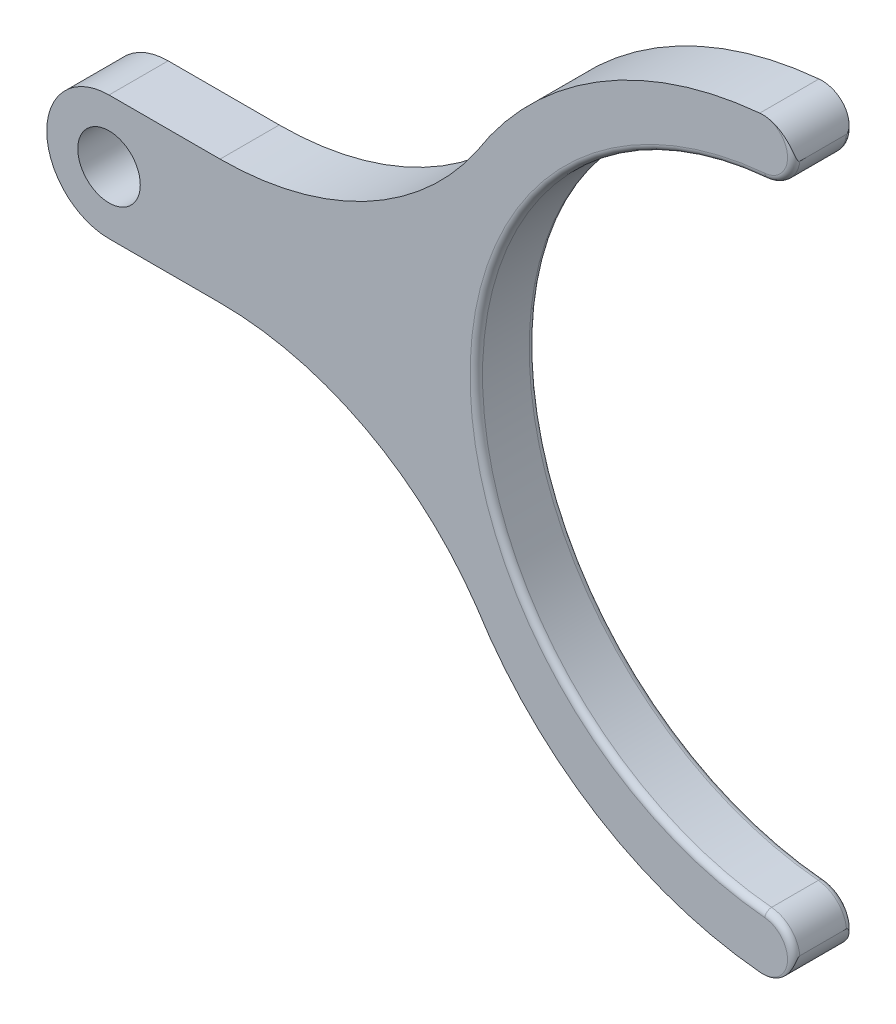
ISO-10303-21;
HEADER;
FILE_DESCRIPTION(('STEP AP214'),'2;1');
FILE_NAME('part.step','',(''),(''),'','','');
FILE_SCHEMA(('AUTOMOTIVE_DESIGN { 1 0 10303 214 1 1 1 1 }'));
ENDSEC;
DATA;
#1=APPLICATION_CONTEXT('core data for automotive mechanical design processes');
#2=APPLICATION_PROTOCOL_DEFINITION('international standard','automotive_design',2000,#1);
#3=PRODUCT_CONTEXT('',#1,'mechanical');
#4=PRODUCT('Part','Part','',(#3));
#5=PRODUCT_RELATED_PRODUCT_CATEGORY('part','',(#4));
#6=PRODUCT_DEFINITION_FORMATION('','',#4);
#7=PRODUCT_DEFINITION_CONTEXT('part definition',#1,'design');
#8=PRODUCT_DEFINITION('design','',#6,#7);
#9=PRODUCT_DEFINITION_SHAPE('','',#8);
#10=(LENGTH_UNIT() NAMED_UNIT(*) SI_UNIT(.MILLI.,.METRE.));
#11=(NAMED_UNIT(*) PLANE_ANGLE_UNIT() SI_UNIT($,.RADIAN.));
#12=(NAMED_UNIT(*) SI_UNIT($,.STERADIAN.) SOLID_ANGLE_UNIT());
#13=UNCERTAINTY_MEASURE_WITH_UNIT(LENGTH_MEASURE(1.E-05),#10,'distance_accuracy_value','');
#14=(GEOMETRIC_REPRESENTATION_CONTEXT(3) GLOBAL_UNCERTAINTY_ASSIGNED_CONTEXT((#13)) GLOBAL_UNIT_ASSIGNED_CONTEXT((#10,
#11,#12)) REPRESENTATION_CONTEXT('',''));
#15=CARTESIAN_POINT('',(0.,0.,0.));
#16=DIRECTION('',(0.,0.,1.));
#17=DIRECTION('',(1.,0.,0.));
#18=AXIS2_PLACEMENT_3D('',#15,#16,#17);
#19=CARTESIAN_POINT('',(-41.1562310109537,60.,4.75));
#20=DIRECTION('',(0.,0.,1.));
#21=DIRECTION('',(1.,0.,0.));
#22=AXIS2_PLACEMENT_3D('',#19,#20,#21);
#23=PLANE('',#22);
#24=CARTESIAN_POINT('',(46.,-54.7722557505166,4.75));
#25=DIRECTION('',(0.,0.,1.));
#26=DIRECTION('',(1.,0.,0.));
#27=AXIS2_PLACEMENT_3D('',#24,#25,#26);
#28=CIRCLE('',#27,5.);
#29=CARTESIAN_POINT('',(45.5454545454545,-59.7515517278363,4.75));
#30=VERTEX_POINT('',#29);
#31=CARTESIAN_POINT('',(46.4028910081031,-59.7559972000292,4.75));
#32=VERTEX_POINT('',#31);
#33=EDGE_CURVE('E196',#30,#32,#28,.T.);
#34=ORIENTED_EDGE('',*,*,#33,.T.);
#35=CARTESIAN_POINT('',(46.,-55.7763390695374,4.75));
#36=DIRECTION('',(0.,0.,1.));
#37=DIRECTION('',(1.,0.,0.));
#38=AXIS2_PLACEMENT_3D('',#35,#36,#37);
#39=CIRCLE('',#38,4.);
#40=CARTESIAN_POINT('',(46.3571428571428,-51.7923148502847,4.75));
#41=VERTEX_POINT('',#40);
#42=EDGE_CURVE('E453',#32,#41,#39,.T.);
#43=ORIENTED_EDGE('',*,*,#42,.T.);
#44=CARTESIAN_POINT('',(51.,0.,4.75));
#45=DIRECTION('',(0.,0.,1.));
#46=DIRECTION('',(1.,0.,0.));
#47=AXIS2_PLACEMENT_3D('',#44,#45,#46);
#48=CIRCLE('',#47,52.);
#49=CARTESIAN_POINT('',(46.3571428571428,51.7923148502847,4.75));
#50=VERTEX_POINT('',#49);
#51=EDGE_CURVE('E56',#41,#50,#48,.F.);
#52=ORIENTED_EDGE('',*,*,#51,.T.);
#53=CARTESIAN_POINT('',(46.,55.7763390695374,4.75));
#54=DIRECTION('',(0.,0.,1.));
#55=DIRECTION('',(1.,0.,0.));
#56=AXIS2_PLACEMENT_3D('',#53,#54,#55);
#57=CIRCLE('',#56,4.);
#58=CARTESIAN_POINT('',(46.4028910081031,59.7559972000292,4.75));
#59=VERTEX_POINT('',#58);
#60=EDGE_CURVE('E454',#50,#59,#57,.T.);
#61=ORIENTED_EDGE('',*,*,#60,.T.);
#62=CARTESIAN_POINT('',(46.,54.7722557505166,4.75));
#63=DIRECTION('',(0.,0.,1.));
#64=DIRECTION('',(1.,0.,0.));
#65=AXIS2_PLACEMENT_3D('',#62,#63,#64);
#66=CIRCLE('',#65,5.);
#67=CARTESIAN_POINT('',(45.5454545454545,59.7515517278363,4.75));
#68=VERTEX_POINT('',#67);
#69=EDGE_CURVE('E198',#59,#68,#66,.T.);
#70=ORIENTED_EDGE('',*,*,#69,.T.);
#71=CARTESIAN_POINT('',(51.,0.,4.75));
#72=DIRECTION('',(0.,0.,1.));
#73=DIRECTION('',(1.,0.,0.));
#74=AXIS2_PLACEMENT_3D('',#71,#72,#73);
#75=CIRCLE('',#74,60.);
#76=CARTESIAN_POINT('',(0.,31.6069612585582,4.75));
#77=VERTEX_POINT('',#76);
#78=EDGE_CURVE('E172',#68,#77,#75,.T.);
#79=ORIENTED_EDGE('',*,*,#78,.T.);
#80=CARTESIAN_POINT('',(-41.1562310109537,60.,4.75));
#81=DIRECTION('',(0.,0.,-1.));
#82=DIRECTION('',(1.,0.,0.));
#83=AXIS2_PLACEMENT_3D('',#80,#81,#82);
#84=CIRCLE('',#83,50.);
#85=CARTESIAN_POINT('',(-41.1562310109537,9.99999999999999,4.75));
#86=VERTEX_POINT('',#85);
#87=EDGE_CURVE('E166',#77,#86,#84,.T.);
#88=ORIENTED_EDGE('',*,*,#87,.T.);
#89=DIRECTION('',(-1.,0.,0.));
#90=VECTOR('',#89,1.);
#91=CARTESIAN_POINT('',(-41.1562310109537,9.99999999999999,4.75));
#92=LINE('',#91,#90);
#93=CARTESIAN_POINT('',(-59.,10.,4.75));
#94=VERTEX_POINT('',#93);
#95=EDGE_CURVE('E159',#86,#94,#92,.T.);
#96=ORIENTED_EDGE('',*,*,#95,.T.);
#97=CARTESIAN_POINT('',(-59.,0.,4.75));
#98=DIRECTION('',(0.,0.,1.));
#99=DIRECTION('',(1.,0.,0.));
#100=AXIS2_PLACEMENT_3D('',#97,#98,#99);
#101=CIRCLE('',#100,10.);
#102=CARTESIAN_POINT('',(-59.,-10.,4.75));
#103=VERTEX_POINT('',#102);
#104=EDGE_CURVE('E170',#94,#103,#101,.T.);
#105=ORIENTED_EDGE('',*,*,#104,.T.);
#106=DIRECTION('',(1.,0.,0.));
#107=VECTOR('',#106,1.);
#108=CARTESIAN_POINT('',(-41.1562310109537,-9.99999999999999,4.75));
#109=LINE('',#108,#107);
#110=CARTESIAN_POINT('',(-41.1562310109537,-9.99999999999999,4.75));
#111=VERTEX_POINT('',#110);
#112=EDGE_CURVE('E495',#103,#111,#109,.T.);
#113=ORIENTED_EDGE('',*,*,#112,.T.);
#114=CARTESIAN_POINT('',(-41.1562310109537,-60.,4.75));
#115=DIRECTION('',(0.,0.,-1.));
#116=DIRECTION('',(-1.,0.,0.));
#117=AXIS2_PLACEMENT_3D('',#114,#115,#116);
#118=CIRCLE('',#117,50.);
#119=CARTESIAN_POINT('',(0.,-31.6069612585582,4.75));
#120=VERTEX_POINT('',#119);
#121=EDGE_CURVE('E507',#111,#120,#118,.T.);
#122=ORIENTED_EDGE('',*,*,#121,.T.);
#123=CARTESIAN_POINT('',(51.,0.,4.75));
#124=DIRECTION('',(0.,0.,1.));
#125=DIRECTION('',(1.,0.,0.));
#126=AXIS2_PLACEMENT_3D('',#123,#124,#125);
#127=CIRCLE('',#126,60.);
#128=EDGE_CURVE('E504',#120,#30,#127,.T.);
#129=ORIENTED_EDGE('',*,*,#128,.T.);
#130=EDGE_LOOP('',(#34,#43,#52,#61,#70,#79,#88,#96,#105,#113,#122,#129));
#131=FACE_BOUND('',#130,.T.);
#132=CARTESIAN_POINT('',(-59.,0.,4.75));
#133=DIRECTION('',(0.,0.,1.));
#134=DIRECTION('',(1.,0.,0.));
#135=AXIS2_PLACEMENT_3D('',#132,#133,#134);
#136=CIRCLE('',#135,5.02);
#137=CARTESIAN_POINT('',(-53.98,0.,4.75));
#138=VERTEX_POINT('',#137);
#139=EDGE_CURVE('E503',#138,#138,#136,.T.);
#140=ORIENTED_EDGE('',*,*,#139,.F.);
#141=EDGE_LOOP('',(#140));
#142=FACE_BOUND('',#141,.T.);
#143=ADVANCED_FACE('F41',(#131,#142),#23,.T.);
#144=CARTESIAN_POINT('',(-41.1562310109537,60.,-4.75));
#145=DIRECTION('',(0.,0.,1.));
#146=DIRECTION('',(1.,0.,0.));
#147=AXIS2_PLACEMENT_3D('',#144,#145,#146);
#148=PLANE('',#147);
#149=CARTESIAN_POINT('',(51.,0.,-4.75));
#150=DIRECTION('',(0.,0.,1.));
#151=DIRECTION('',(1.,0.,0.));
#152=AXIS2_PLACEMENT_3D('',#149,#150,#151);
#153=CIRCLE('',#152,52.);
#154=CARTESIAN_POINT('',(46.3571428571428,51.7923148502847,-4.75));
#155=VERTEX_POINT('',#154);
#156=CARTESIAN_POINT('',(46.3571428571428,-51.7923148502847,-4.75));
#157=VERTEX_POINT('',#156);
#158=EDGE_CURVE('E209',#155,#157,#153,.T.);
#159=ORIENTED_EDGE('',*,*,#158,.T.);
#160=CARTESIAN_POINT('',(46.,-55.7763390695374,-4.75));
#161=DIRECTION('',(0.,0.,1.));
#162=DIRECTION('',(1.,0.,0.));
#163=AXIS2_PLACEMENT_3D('',#160,#161,#162);
#164=CIRCLE('',#163,4.);
#165=CARTESIAN_POINT('',(46.4028910081031,-59.7559972000292,-4.75));
#166=VERTEX_POINT('',#165);
#167=EDGE_CURVE('E221',#157,#166,#164,.F.);
#168=ORIENTED_EDGE('',*,*,#167,.T.);
#169=CARTESIAN_POINT('',(46.,-54.7722557505166,-4.75));
#170=DIRECTION('',(0.,0.,1.));
#171=DIRECTION('',(1.,0.,0.));
#172=AXIS2_PLACEMENT_3D('',#169,#170,#171);
#173=CIRCLE('',#172,5.);
#174=CARTESIAN_POINT('',(45.5454545454545,-59.7515517278363,-4.75));
#175=VERTEX_POINT('',#174);
#176=EDGE_CURVE('E187',#166,#175,#173,.F.);
#177=ORIENTED_EDGE('',*,*,#176,.T.);
#178=CARTESIAN_POINT('',(51.,0.,-4.75));
#179=DIRECTION('',(0.,0.,1.));
#180=DIRECTION('',(1.,0.,0.));
#181=AXIS2_PLACEMENT_3D('',#178,#179,#180);
#182=CIRCLE('',#181,60.);
#183=CARTESIAN_POINT('',(0.,-31.6069612585582,-4.75));
#184=VERTEX_POINT('',#183);
#185=EDGE_CURVE('E475',#184,#175,#182,.T.);
#186=ORIENTED_EDGE('',*,*,#185,.F.);
#187=CARTESIAN_POINT('',(-41.1562310109537,-60.,-4.75));
#188=DIRECTION('',(0.,0.,-1.));
#189=DIRECTION('',(-1.,0.,0.));
#190=AXIS2_PLACEMENT_3D('',#187,#188,#189);
#191=CIRCLE('',#190,50.);
#192=CARTESIAN_POINT('',(-41.1562310109537,-9.99999999999999,-4.75));
#193=VERTEX_POINT('',#192);
#194=EDGE_CURVE('E473',#193,#184,#191,.T.);
#195=ORIENTED_EDGE('',*,*,#194,.F.);
#196=DIRECTION('',(1.,0.,0.));
#197=VECTOR('',#196,1.);
#198=CARTESIAN_POINT('',(-41.1562310109537,-9.99999999999999,-4.75));
#199=LINE('',#198,#197);
#200=CARTESIAN_POINT('',(-59.,-10.,-4.75));
#201=VERTEX_POINT('',#200);
#202=EDGE_CURVE('E493',#201,#193,#199,.T.);
#203=ORIENTED_EDGE('',*,*,#202,.F.);
#204=CARTESIAN_POINT('',(-59.,0.,-4.75));
#205=DIRECTION('',(0.,0.,1.));
#206=DIRECTION('',(1.,0.,0.));
#207=AXIS2_PLACEMENT_3D('',#204,#205,#206);
#208=CIRCLE('',#207,10.);
#209=CARTESIAN_POINT('',(-59.,10.,-4.75));
#210=VERTEX_POINT('',#209);
#211=EDGE_CURVE('E492',#210,#201,#208,.T.);
#212=ORIENTED_EDGE('',*,*,#211,.F.);
#213=DIRECTION('',(-1.,0.,0.));
#214=VECTOR('',#213,1.);
#215=CARTESIAN_POINT('',(-41.1562310109537,9.99999999999999,-4.75));
#216=LINE('',#215,#214);
#217=CARTESIAN_POINT('',(-41.1562310109537,9.99999999999999,-4.75));
#218=VERTEX_POINT('',#217);
#219=EDGE_CURVE('E498',#218,#210,#216,.T.);
#220=ORIENTED_EDGE('',*,*,#219,.F.);
#221=CARTESIAN_POINT('',(-41.1562310109537,60.,-4.75));
#222=DIRECTION('',(0.,0.,-1.));
#223=DIRECTION('',(1.,0.,0.));
#224=AXIS2_PLACEMENT_3D('',#221,#222,#223);
#225=CIRCLE('',#224,50.);
#226=CARTESIAN_POINT('',(0.,31.6069612585582,-4.75));
#227=VERTEX_POINT('',#226);
#228=EDGE_CURVE('E185',#227,#218,#225,.T.);
#229=ORIENTED_EDGE('',*,*,#228,.F.);
#230=CARTESIAN_POINT('',(51.,0.,-4.75));
#231=DIRECTION('',(0.,0.,1.));
#232=DIRECTION('',(1.,0.,0.));
#233=AXIS2_PLACEMENT_3D('',#230,#231,#232);
#234=CIRCLE('',#233,60.);
#235=CARTESIAN_POINT('',(45.5454545454545,59.7515517278363,-4.75));
#236=VERTEX_POINT('',#235);
#237=EDGE_CURVE('E178',#236,#227,#234,.T.);
#238=ORIENTED_EDGE('',*,*,#237,.F.);
#239=CARTESIAN_POINT('',(46.,54.7722557505166,-4.75));
#240=DIRECTION('',(0.,0.,1.));
#241=DIRECTION('',(1.,0.,0.));
#242=AXIS2_PLACEMENT_3D('',#239,#240,#241);
#243=CIRCLE('',#242,5.);
#244=CARTESIAN_POINT('',(46.4028910081031,59.7559972000292,-4.75));
#245=VERTEX_POINT('',#244);
#246=EDGE_CURVE('E182',#236,#245,#243,.F.);
#247=ORIENTED_EDGE('',*,*,#246,.T.);
#248=CARTESIAN_POINT('',(46.,55.7763390695374,-4.75));
#249=DIRECTION('',(0.,0.,1.));
#250=DIRECTION('',(1.,0.,0.));
#251=AXIS2_PLACEMENT_3D('',#248,#249,#250);
#252=CIRCLE('',#251,4.);
#253=EDGE_CURVE('E219',#245,#155,#252,.F.);
#254=ORIENTED_EDGE('',*,*,#253,.T.);
#255=EDGE_LOOP('',(#159,#168,#177,#186,#195,#203,#212,#220,#229,#238,#247,#254));
#256=FACE_BOUND('',#255,.T.);
#257=CARTESIAN_POINT('',(-59.,0.,-4.75));
#258=DIRECTION('',(0.,0.,1.));
#259=DIRECTION('',(1.,0.,0.));
#260=AXIS2_PLACEMENT_3D('',#257,#258,#259);
#261=CIRCLE('',#260,5.02);
#262=CARTESIAN_POINT('',(-53.98,0.,-4.75));
#263=VERTEX_POINT('',#262);
#264=EDGE_CURVE('E214',#263,#263,#261,.T.);
#265=ORIENTED_EDGE('',*,*,#264,.T.);
#266=EDGE_LOOP('',(#265));
#267=FACE_BOUND('',#266,.T.);
#268=ADVANCED_FACE('F258',(#256,#267),#148,.F.);
#269=CARTESIAN_POINT('',(-41.1562310109537,60.,4.75));
#270=DIRECTION('',(0.,0.,-1.));
#271=DIRECTION('',(-1.,0.,0.));
#272=AXIS2_PLACEMENT_3D('',#269,#270,#271);
#273=CYLINDRICAL_SURFACE('',#272,50.);
#274=ORIENTED_EDGE('',*,*,#228,.T.);
#275=DIRECTION('',(0.,0.,-1.));
#276=VECTOR('',#275,1.);
#277=CARTESIAN_POINT('',(-41.1562310109537,9.99999999999999,4.75));
#278=LINE('',#277,#276);
#279=EDGE_CURVE('E162',#86,#218,#278,.T.);
#280=ORIENTED_EDGE('',*,*,#279,.F.);
#281=ORIENTED_EDGE('',*,*,#87,.F.);
#282=DIRECTION('',(0.,0.,-1.));
#283=VECTOR('',#282,1.);
#284=CARTESIAN_POINT('',(0.,31.6069612585582,4.75));
#285=LINE('',#284,#283);
#286=EDGE_CURVE('E479',#77,#227,#285,.T.);
#287=ORIENTED_EDGE('',*,*,#286,.T.);
#288=EDGE_LOOP('',(#274,#280,#281,#287));
#289=FACE_BOUND('',#288,.T.);
#290=ADVANCED_FACE('F179',(#289),#273,.F.);
#291=CARTESIAN_POINT('',(-41.1562310109537,9.99999999999999,4.75));
#292=DIRECTION('',(0.,-1.,0.));
#293=DIRECTION('',(1.,0.,0.));
#294=AXIS2_PLACEMENT_3D('',#291,#292,#293);
#295=PLANE('',#294);
#296=ORIENTED_EDGE('',*,*,#219,.T.);
#297=DIRECTION('',(0.,0.,-1.));
#298=VECTOR('',#297,1.);
#299=CARTESIAN_POINT('',(-59.,10.,4.75));
#300=LINE('',#299,#298);
#301=EDGE_CURVE('E164',#94,#210,#300,.T.);
#302=ORIENTED_EDGE('',*,*,#301,.F.);
#303=ORIENTED_EDGE('',*,*,#95,.F.);
#304=ORIENTED_EDGE('',*,*,#279,.T.);
#305=EDGE_LOOP('',(#296,#302,#303,#304));
#306=FACE_BOUND('',#305,.T.);
#307=ADVANCED_FACE('F160',(#306),#295,.F.);
#308=CARTESIAN_POINT('',(-59.,0.,4.75));
#309=DIRECTION('',(0.,0.,-1.));
#310=DIRECTION('',(-1.,0.,0.));
#311=AXIS2_PLACEMENT_3D('',#308,#309,#310);
#312=CYLINDRICAL_SURFACE('',#311,10.);
#313=ORIENTED_EDGE('',*,*,#211,.T.);
#314=DIRECTION('',(0.,0.,-1.));
#315=VECTOR('',#314,1.);
#316=CARTESIAN_POINT('',(-59.,-10.,4.75));
#317=LINE('',#316,#315);
#318=EDGE_CURVE('E189',#103,#201,#317,.T.);
#319=ORIENTED_EDGE('',*,*,#318,.F.);
#320=ORIENTED_EDGE('',*,*,#104,.F.);
#321=ORIENTED_EDGE('',*,*,#301,.T.);
#322=EDGE_LOOP('',(#313,#319,#320,#321));
#323=FACE_BOUND('',#322,.T.);
#324=ADVANCED_FACE('F288',(#323),#312,.T.);
#325=CARTESIAN_POINT('',(-41.1562310109537,-9.99999999999999,4.75));
#326=DIRECTION('',(0.,1.,0.));
#327=DIRECTION('',(-1.,0.,0.));
#328=AXIS2_PLACEMENT_3D('',#325,#326,#327);
#329=PLANE('',#328);
#330=ORIENTED_EDGE('',*,*,#202,.T.);
#331=DIRECTION('',(0.,0.,-1.));
#332=VECTOR('',#331,1.);
#333=CARTESIAN_POINT('',(-41.1562310109537,-9.99999999999999,4.75));
#334=LINE('',#333,#332);
#335=EDGE_CURVE('E483',#111,#193,#334,.T.);
#336=ORIENTED_EDGE('',*,*,#335,.F.);
#337=ORIENTED_EDGE('',*,*,#112,.F.);
#338=ORIENTED_EDGE('',*,*,#318,.T.);
#339=EDGE_LOOP('',(#330,#336,#337,#338));
#340=FACE_BOUND('',#339,.T.);
#341=ADVANCED_FACE('F282',(#340),#329,.F.);
#342=CARTESIAN_POINT('',(-41.1562310109537,-60.,4.75));
#343=DIRECTION('',(0.,0.,-1.));
#344=DIRECTION('',(-1.,0.,0.));
#345=AXIS2_PLACEMENT_3D('',#342,#343,#344);
#346=CYLINDRICAL_SURFACE('',#345,50.);
#347=ORIENTED_EDGE('',*,*,#194,.T.);
#348=DIRECTION('',(0.,0.,-1.));
#349=VECTOR('',#348,1.);
#350=CARTESIAN_POINT('',(0.,-31.6069612585582,4.75));
#351=LINE('',#350,#349);
#352=EDGE_CURVE('E481',#120,#184,#351,.T.);
#353=ORIENTED_EDGE('',*,*,#352,.F.);
#354=ORIENTED_EDGE('',*,*,#121,.F.);
#355=ORIENTED_EDGE('',*,*,#335,.T.);
#356=EDGE_LOOP('',(#347,#353,#354,#355));
#357=FACE_BOUND('',#356,.T.);
#358=ADVANCED_FACE('F283',(#357),#346,.F.);
#359=CARTESIAN_POINT('',(51.,0.,4.75));
#360=DIRECTION('',(0.,0.,-1.));
#361=DIRECTION('',(-1.,0.,0.));
#362=AXIS2_PLACEMENT_3D('',#359,#360,#361);
#363=CYLINDRICAL_SURFACE('',#362,60.);
#364=ORIENTED_EDGE('',*,*,#185,.T.);
#365=DIRECTION('',(0.,0.,-1.));
#366=VECTOR('',#365,1.);
#367=CARTESIAN_POINT('',(45.5454545454545,-59.7515517278363,4.75));
#368=LINE('',#367,#366);
#369=EDGE_CURVE('E194',#175,#30,#368,.F.);
#370=ORIENTED_EDGE('',*,*,#369,.T.);
#371=ORIENTED_EDGE('',*,*,#128,.F.);
#372=ORIENTED_EDGE('',*,*,#352,.T.);
#373=EDGE_LOOP('',(#364,#370,#371,#372));
#374=FACE_BOUND('',#373,.T.);
#375=ADVANCED_FACE('F280',(#374),#363,.T.);
#376=CARTESIAN_POINT('',(51.,0.,4.75));
#377=DIRECTION('',(0.,0.,-1.));
#378=DIRECTION('',(-1.,0.,0.));
#379=AXIS2_PLACEMENT_3D('',#376,#377,#378);
#380=CYLINDRICAL_SURFACE('',#379,51.);
#381=DIRECTION('',(0.,0.,-1.));
#382=VECTOR('',#381,1.);
#383=CARTESIAN_POINT('',(46.4464285714286,-50.7963087954715,4.75));
#384=LINE('',#383,#382);
#385=CARTESIAN_POINT('',(46.4464285714286,-50.7963087954715,3.75));
#386=VERTEX_POINT('',#385);
#387=CARTESIAN_POINT('',(46.4464285714286,-50.7963087954715,-3.75));
#388=VERTEX_POINT('',#387);
#389=EDGE_CURVE('E204',#386,#388,#384,.T.);
#390=ORIENTED_EDGE('',*,*,#389,.T.);
#391=CARTESIAN_POINT('',(51.,0.,-3.75));
#392=DIRECTION('',(0.,0.,1.));
#393=DIRECTION('',(1.,0.,0.));
#394=AXIS2_PLACEMENT_3D('',#391,#392,#393);
#395=CIRCLE('',#394,51.);
#396=CARTESIAN_POINT('',(46.4464285714286,50.7963087954715,-3.75));
#397=VERTEX_POINT('',#396);
#398=EDGE_CURVE('E11',#388,#397,#395,.F.);
#399=ORIENTED_EDGE('',*,*,#398,.T.);
#400=DIRECTION('',(0.,0.,-1.));
#401=VECTOR('',#400,1.);
#402=CARTESIAN_POINT('',(46.4464285714286,50.7963087954715,4.75));
#403=LINE('',#402,#401);
#404=CARTESIAN_POINT('',(46.4464285714286,50.7963087954715,3.75));
#405=VERTEX_POINT('',#404);
#406=EDGE_CURVE('E197',#397,#405,#403,.F.);
#407=ORIENTED_EDGE('',*,*,#406,.T.);
#408=CARTESIAN_POINT('',(51.,0.,3.75));
#409=DIRECTION('',(0.,0.,1.));
#410=DIRECTION('',(1.,0.,0.));
#411=AXIS2_PLACEMENT_3D('',#408,#409,#410);
#412=CIRCLE('',#411,51.);
#413=EDGE_CURVE('E51',#405,#386,#412,.T.);
#414=ORIENTED_EDGE('',*,*,#413,.T.);
#415=EDGE_LOOP('',(#390,#399,#407,#414));
#416=FACE_BOUND('',#415,.T.);
#417=ADVANCED_FACE('F271',(#416),#380,.F.);
#418=CARTESIAN_POINT('',(51.,0.,4.75));
#419=DIRECTION('',(0.,0.,-1.));
#420=DIRECTION('',(-1.,0.,0.));
#421=AXIS2_PLACEMENT_3D('',#418,#419,#420);
#422=CYLINDRICAL_SURFACE('',#421,60.);
#423=ORIENTED_EDGE('',*,*,#78,.F.);
#424=DIRECTION('',(0.,0.,-1.));
#425=VECTOR('',#424,1.);
#426=CARTESIAN_POINT('',(45.5454545454545,59.7515517278363,4.75));
#427=LINE('',#426,#425);
#428=EDGE_CURVE('E207',#68,#236,#427,.T.);
#429=ORIENTED_EDGE('',*,*,#428,.T.);
#430=ORIENTED_EDGE('',*,*,#237,.T.);
#431=ORIENTED_EDGE('',*,*,#286,.F.);
#432=EDGE_LOOP('',(#423,#429,#430,#431));
#433=FACE_BOUND('',#432,.T.);
#434=ADVANCED_FACE('F272',(#433),#422,.T.);
#435=CARTESIAN_POINT('',(-59.,0.,4.75));
#436=DIRECTION('',(0.,0.,-1.));
#437=DIRECTION('',(-1.,0.,0.));
#438=AXIS2_PLACEMENT_3D('',#435,#436,#437);
#439=CYLINDRICAL_SURFACE('',#438,5.02);
#440=ORIENTED_EDGE('',*,*,#139,.T.);
#441=EDGE_LOOP('',(#440));
#442=FACE_BOUND('',#441,.T.);
#443=ORIENTED_EDGE('',*,*,#264,.F.);
#444=EDGE_LOOP('',(#443));
#445=FACE_BOUND('',#444,.T.);
#446=ADVANCED_FACE('F268',(#442,#445),#439,.F.);
#447=CARTESIAN_POINT('',(46.,-55.7763390695374,4.75));
#448=DIRECTION('',(0.,0.,-1.));
#449=DIRECTION('',(-1.,0.,0.));
#450=AXIS2_PLACEMENT_3D('',#447,#448,#449);
#451=CYLINDRICAL_SURFACE('',#450,5.);
#452=DIRECTION('',(0.,0.,-1.));
#453=VECTOR('',#452,1.);
#454=CARTESIAN_POINT('',(50.9747315678452,-55.274297410027,0.));
#455=LINE('',#454,#453);
#456=CARTESIAN_POINT('',(50.9747315678452,-55.274297410027,-3.75));
#457=VERTEX_POINT('',#456);
#458=CARTESIAN_POINT('',(50.9747315678452,-55.274297410027,3.75));
#459=VERTEX_POINT('',#458);
#460=EDGE_CURVE('E208',#457,#459,#455,.F.);
#461=ORIENTED_EDGE('',*,*,#460,.F.);
#462=CARTESIAN_POINT('',(46.,-55.7763390695374,-3.75));
#463=DIRECTION('',(0.,0.,1.));
#464=DIRECTION('',(1.,0.,0.));
#465=AXIS2_PLACEMENT_3D('',#462,#463,#464);
#466=CIRCLE('',#465,5.);
#467=EDGE_CURVE('E529',#457,#388,#466,.T.);
#468=ORIENTED_EDGE('',*,*,#467,.T.);
#469=ORIENTED_EDGE('',*,*,#389,.F.);
#470=CARTESIAN_POINT('',(46.,-55.7763390695374,3.75));
#471=DIRECTION('',(0.,0.,1.));
#472=DIRECTION('',(1.,0.,0.));
#473=AXIS2_PLACEMENT_3D('',#470,#471,#472);
#474=CIRCLE('',#473,5.);
#475=EDGE_CURVE('E521',#386,#459,#474,.F.);
#476=ORIENTED_EDGE('',*,*,#475,.T.);
#477=EDGE_LOOP('',(#461,#468,#469,#476));
#478=FACE_BOUND('',#477,.T.);
#479=ADVANCED_FACE('F328',(#478),#451,.T.);
#480=CARTESIAN_POINT('',(46.,-54.7722557505166,4.75));
#481=DIRECTION('',(0.,0.,-1.));
#482=DIRECTION('',(-1.,0.,0.));
#483=AXIS2_PLACEMENT_3D('',#480,#481,#482);
#484=CYLINDRICAL_SURFACE('',#483,5.);
#485=ORIENTED_EDGE('',*,*,#176,.F.);
#486=CARTESIAN_POINT('',(46.4028910081031,-59.7559972000292,-4.75));
#487=CARTESIAN_POINT('',(46.543018410016,-59.74468431655,-4.74998737763623));
#488=CARTESIAN_POINT('',(46.6826636265743,-59.7274322715306,-4.74998767744177));
#489=CARTESIAN_POINT('',(46.9600022113909,-59.6812390491605,-4.7498446862293));
#490=CARTESIAN_POINT('',(47.0976956501337,-59.6522982950433,-4.74970140041007));
#491=CARTESIAN_POINT('',(47.3701041780833,-59.5829285563967,-4.74910193492747));
#492=CARTESIAN_POINT('',(47.5048203273625,-59.5425037342148,-4.74864586854543));
#493=CARTESIAN_POINT('',(47.7703654344306,-59.4504551644518,-4.74717371559954));
#494=CARTESIAN_POINT('',(47.9011944522195,-59.3988315898322,-4.74615763768453));
#495=CARTESIAN_POINT('',(48.1580915385011,-59.2847278512322,-4.74327540536567));
#496=CARTESIAN_POINT('',(48.2841574152734,-59.2222427617274,-4.74140886466517));
#497=CARTESIAN_POINT('',(48.5306033496373,-59.0868610731668,-4.73649731857756));
#498=CARTESIAN_POINT('',(48.6509814058281,-59.0139608450616,-4.73345190178808));
#499=CARTESIAN_POINT('',(48.8850675026033,-58.8583452313694,-4.72582905269739));
#500=CARTESIAN_POINT('',(48.9987793096147,-58.7756354696061,-4.72125249548748));
#501=CARTESIAN_POINT('',(49.2187795909512,-58.6009869421599,-4.71018632839963));
#502=CARTESIAN_POINT('',(49.3250681850162,-58.509048325401,-4.70369674938843));
#503=CARTESIAN_POINT('',(49.5287436332454,-58.3173080305245,-4.68844685082207));
#504=CARTESIAN_POINT('',(49.6261867040687,-58.2175648067853,-4.67970246234625));
#505=CARTESIAN_POINT('',(49.8122508996937,-58.0104821373131,-4.65948071528019));
#506=CARTESIAN_POINT('',(49.9008751926279,-57.9031454434055,-4.64800434321382));
#507=CARTESIAN_POINT('',(50.0687835443343,-57.6816094002095,-4.62178678075055));
#508=CARTESIAN_POINT('',(50.1480584969588,-57.5674035212114,-4.60704244698203));
#509=CARTESIAN_POINT('',(50.2965861394904,-57.3332238273222,-4.57365307464862));
#510=CARTESIAN_POINT('',(50.3658420238497,-57.2132518671978,-4.55500928403324));
#511=CARTESIAN_POINT('',(50.4764090693178,-57.0020202746159,-4.51866007592201));
#512=CARTESIAN_POINT('',(50.5201912885704,-56.9118496768522,-4.50208449522542));
#513=CARTESIAN_POINT('',(50.6020578255949,-56.729559565383,-4.46589239084438));
#514=CARTESIAN_POINT('',(50.6401431756542,-56.6374404082229,-4.44627641940151));
#515=CARTESIAN_POINT('',(50.7103667209502,-56.4522036394114,-4.40334096665974));
#516=CARTESIAN_POINT('',(50.7425257790564,-56.3590908004565,-4.38003503609888));
#517=CARTESIAN_POINT('',(50.8009498456067,-56.1724046382395,-4.32853029469466));
#518=CARTESIAN_POINT('',(50.8272196237063,-56.0788317507962,-4.30033547636505));
#519=CARTESIAN_POINT('',(50.8618356678126,-55.9404765862273,-4.2531404824015));
#520=CARTESIAN_POINT('',(50.8724561467149,-55.8953276096369,-4.23685908161626));
#521=CARTESIAN_POINT('',(50.8922992511259,-55.8054658787988,-4.2021151146743));
#522=CARTESIAN_POINT('',(50.9015197379121,-55.7607538876922,-4.18364928649287));
#523=CARTESIAN_POINT('',(50.9187983287456,-55.670912965811,-4.14322930614268));
#524=CARTESIAN_POINT('',(50.9268096921388,-55.6258166213151,-4.12118230164755));
#525=CARTESIAN_POINT('',(50.9412503183496,-55.5377661614422,-4.07282375601056));
#526=CARTESIAN_POINT('',(50.9476851386221,-55.4948049593781,-4.04652775348621));
#527=CARTESIAN_POINT('',(50.955566160956,-55.4375763630783,-4.0046846070937));
#528=CARTESIAN_POINT('',(50.9577132772818,-55.421354760787,-3.99196801738594));
#529=CARTESIAN_POINT('',(50.9617130005429,-55.3900357042193,-3.96503866086491));
#530=CARTESIAN_POINT('',(50.963564505527,-55.3749425627336,-3.95082060972081));
#531=CARTESIAN_POINT('',(50.9669526586124,-55.3463564728171,-3.92034242238047));
#532=CARTESIAN_POINT('',(50.9684837050354,-55.3328934926573,-3.90405287217443));
#533=CARTESIAN_POINT('',(50.9711058217861,-55.309142527326,-3.86939921021401));
#534=CARTESIAN_POINT('',(50.9722012452868,-55.2988233825875,-3.8510580993315));
#535=CARTESIAN_POINT('',(50.9735693343871,-55.2857130780113,-3.81886896827523));
#536=CARTESIAN_POINT('',(50.973994964553,-55.2815562392182,-3.80559937726798));
#537=CARTESIAN_POINT('',(50.974580536424,-55.2757954888481,-3.77825738832846));
#538=CARTESIAN_POINT('',(50.9747352085935,-55.2742422356167,-3.76417445636088));
#539=CARTESIAN_POINT('',(50.9747315678452,-55.274297410027,-3.75));
#540=B_SPLINE_CURVE_WITH_KNOTS('',3,(#486,#487,#488,#489,#490,#491,#492,#493,#494,#495,#496,
#497,#498,#499,#500,#501,#502,#503,#504,#505,#506,#507,#508,#509,#510,#511,#512,#513,#514,#515,
#516,#517,#518,#519,#520,#521,#522,#523,#524,#525,#526,#527,#528,#529,#530,#531,#532,#533,#534,
#535,#536,#537,#538,#539),.UNSPECIFIED.,.F.,.F.,(4,2,2,2,2,2,2,2,2,2,2,2,2,2,2,2,2,2,2,2,2,2,2,
2,2,2,4),(0.,0.421621511026379,0.843227757036001,1.2646813883455,1.68612851089145,
2.10776725399982,2.52955327279717,2.95109863925409,3.37263720442147,3.79127536919564,
4.20976259172479,4.6286541072857,5.04741176887667,5.35200687580742,5.6565467222787,
5.95999308651629,6.26319279824214,6.41061126103541,6.55825271211767,6.71062733301166,
6.86245683132404,6.92456677912688,6.98690310521906,7.05025178836426,7.11295048486754,
7.15444329275892,7.19673444150614),.UNSPECIFIED.);
#541=EDGE_CURVE('E235',#166,#457,#540,.T.);
#542=ORIENTED_EDGE('',*,*,#541,.T.);
#543=ORIENTED_EDGE('',*,*,#460,.T.);
#544=CARTESIAN_POINT('',(50.9747315678452,-55.274297410027,3.75));
#545=CARTESIAN_POINT('',(50.9747339959873,-55.2742612138266,3.7623576774371));
#546=CARTESIAN_POINT('',(50.9746166739668,-55.2754365389461,3.77466544269762));
#547=CARTESIAN_POINT('',(50.97416709531,-55.2798674498789,3.79873707203129));
#548=CARTESIAN_POINT('',(50.9738376770213,-55.2830955576884,3.81050595168362));
#549=CARTESIAN_POINT('',(50.9728560234705,-55.2925731170745,3.83693031974578));
#550=CARTESIAN_POINT('',(50.9721354962607,-55.2994478952088,3.85135426114698));
#551=CARTESIAN_POINT('',(50.9704211040371,-55.3153758322313,3.87898848734));
#552=CARTESIAN_POINT('',(50.969425638235,-55.3244417086006,3.89219104056185));
#553=CARTESIAN_POINT('',(50.966330173667,-55.3517995702201,3.92735779869053));
#554=CARTESIAN_POINT('',(50.9639786410593,-55.3717245961234,3.9480097591055));
#555=CARTESIAN_POINT('',(50.9586822814256,-55.4140766604582,3.98640482890797));
#556=CARTESIAN_POINT('',(50.9557359965936,-55.436509785047,4.00414059267416));
#557=CARTESIAN_POINT('',(50.9475370062988,-55.4955688955303,4.04663295899842));
#558=CARTESIAN_POINT('',(50.9419071261476,-55.5332137515781,4.06988454477639));
#559=CARTESIAN_POINT('',(50.929433021314,-55.6102485848729,4.11296413909311));
#560=CARTESIAN_POINT('',(50.9225860365137,-55.6496423726669,4.13278415959004));
#561=CARTESIAN_POINT('',(50.9002091293486,-55.7695240929443,4.18870393933311));
#562=CARTESIAN_POINT('',(50.8828839782224,-55.8514068352571,4.22107435253383));
#563=CARTESIAN_POINT('',(50.8412324529735,-56.0258435178894,4.28329049432417));
#564=CARTESIAN_POINT('',(50.8163194138749,-56.1185112580863,4.31238142211981));
#565=CARTESIAN_POINT('',(50.7606852474139,-56.3036697382754,4.36544160399676));
#566=CARTESIAN_POINT('',(50.7299579549232,-56.3961601841506,4.38940536350012));
#567=CARTESIAN_POINT('',(50.6628697149124,-56.5797924684989,4.43341527505265));
#568=CARTESIAN_POINT('',(50.6265198527203,-56.6709365821177,4.45346896392153));
#569=CARTESIAN_POINT('',(50.5482559391357,-56.8514498754274,4.49048916846912));
#570=CARTESIAN_POINT('',(50.506341293468,-56.9408188643755,4.50745535396738));
#571=CARTESIAN_POINT('',(50.4099277962281,-57.1314289860316,4.54133457837439));
#572=CARTESIAN_POINT('',(50.3544888364256,-57.2322748833551,4.5578025093706));
#573=CARTESIAN_POINT('',(50.2365657186721,-57.4302227091762,4.5878503421042));
#574=CARTESIAN_POINT('',(50.174080396591,-57.5273240154631,4.60142976555825));
#575=CARTESIAN_POINT('',(50.0423450179698,-57.7172184862717,4.62612505061646));
#576=CARTESIAN_POINT('',(49.9730919164598,-57.8100096836255,4.63723979588832));
#577=CARTESIAN_POINT('',(49.8281880440863,-57.9907012210026,4.65733636444375));
#578=CARTESIAN_POINT('',(49.7525368777909,-58.0786012581706,4.66631805576329));
#579=CARTESIAN_POINT('',(49.5822479813448,-58.26306366478,4.683763455004));
#580=CARTESIAN_POINT('',(49.4865353802318,-58.3586680085545,4.69189815678904));
#581=CARTESIAN_POINT('',(49.2876278970605,-58.541841853846,4.70606022769461));
#582=CARTESIAN_POINT('',(49.1844353707655,-58.6294138655891,4.71208825684877));
#583=CARTESIAN_POINT('',(48.971123044094,-58.7960303606863,4.72240940204596));
#584=CARTESIAN_POINT('',(48.8609960290452,-58.8750657224275,4.72670067550994));
#585=CARTESIAN_POINT('',(48.6346973459138,-59.0239268714017,4.73387716152331));
#586=CARTESIAN_POINT('',(48.5185277527673,-59.0937557912612,4.73676285324767));
#587=CARTESIAN_POINT('',(48.2776842766292,-59.225512882508,4.74151064255199));
#588=CARTESIAN_POINT('',(48.1528656196059,-59.287177631639,4.7433430806085));
#589=CARTESIAN_POINT('',(47.8985589116675,-59.3998695827515,4.74617787815496));
#590=CARTESIAN_POINT('',(47.7690725108058,-59.4509005013795,4.74718052803077));
#591=CARTESIAN_POINT('',(47.5064648952549,-59.5419364981448,4.74863710396622));
#592=CARTESIAN_POINT('',(47.3733484673895,-59.5819553916373,4.74909172001719));
#593=CARTESIAN_POINT('',(47.104300060662,-59.6507580985889,4.74968987091448));
#594=CARTESIAN_POINT('',(46.9683696007396,-59.6795478149066,4.74983356938247));
#595=CARTESIAN_POINT('',(46.7604432209778,-59.7146159702304,4.74995054697814));
#596=CARTESIAN_POINT('',(46.68912684177,-59.7250628300113,4.74997254341042));
#597=CARTESIAN_POINT('',(46.5462148173148,-59.7428518674912,4.74999689070829));
#598=CARTESIAN_POINT('',(46.4746197396904,-59.7501986053071,4.74999927052514));
#599=CARTESIAN_POINT('',(46.4028910081031,-59.7559972000292,4.75));
#600=B_SPLINE_CURVE_WITH_KNOTS('',3,(#544,#545,#546,#547,#548,#549,#550,#551,#552,#553,#554,
#555,#556,#557,#558,#559,#560,#561,#562,#563,#564,#565,#566,#567,#568,#569,#570,#571,#572,#573,
#574,#575,#576,#577,#578,#579,#580,#581,#582,#583,#584,#585,#586,#587,#588,#589,#590,#591,#592,
#593,#594,#595,#596,#597,#598,#599),.UNSPECIFIED.,.F.,.F.,(4,2,2,2,2,2,2,2,2,2,2,2,2,2,2,2,2,2,
2,2,2,2,2,2,2,2,2,4),(0.,0.0369362507723265,0.0733882011525276,0.121102181217257,
0.169100048082432,0.254993349807223,0.341099799638307,0.4745745141486,0.608355873185398,
0.876994002817104,1.17749399062712,1.47831441670453,1.77854913911689,2.07881595006115,
2.42724962565565,2.77574095057855,3.12438979752368,3.47306020844746,3.87916226252951,
4.28513696800598,4.69154126287923,5.09780691387816,5.51501376667711,5.932074555381,
6.34860970156146,6.76492559102456,6.98109919791664,7.1969537068685),.UNSPECIFIED.);
#601=EDGE_CURVE('E223',#459,#32,#600,.T.);
#602=ORIENTED_EDGE('',*,*,#601,.T.);
#603=ORIENTED_EDGE('',*,*,#33,.F.);
#604=ORIENTED_EDGE('',*,*,#369,.F.);
#605=EDGE_LOOP('',(#485,#542,#543,#602,#603,#604));
#606=FACE_BOUND('',#605,.T.);
#607=ADVANCED_FACE('F237',(#606),#484,.T.);
#608=CARTESIAN_POINT('',(46.,55.7763390695374,4.75));
#609=DIRECTION('',(0.,0.,-1.));
#610=DIRECTION('',(-1.,0.,0.));
#611=AXIS2_PLACEMENT_3D('',#608,#609,#610);
#612=CYLINDRICAL_SURFACE('',#611,5.);
#613=ORIENTED_EDGE('',*,*,#406,.F.);
#614=CARTESIAN_POINT('',(46.,55.7763390695374,-3.75));
#615=DIRECTION('',(0.,0.,1.));
#616=DIRECTION('',(1.,0.,0.));
#617=AXIS2_PLACEMENT_3D('',#614,#615,#616);
#618=CIRCLE('',#617,5.);
#619=CARTESIAN_POINT('',(50.9747315678452,55.274297410027,-3.75));
#620=VERTEX_POINT('',#619);
#621=EDGE_CURVE('E535',#397,#620,#618,.T.);
#622=ORIENTED_EDGE('',*,*,#621,.T.);
#623=DIRECTION('',(0.,0.,-1.));
#624=VECTOR('',#623,1.);
#625=CARTESIAN_POINT('',(50.9747315678452,55.274297410027,0.));
#626=LINE('',#625,#624);
#627=CARTESIAN_POINT('',(50.9747315678452,55.274297410027,3.75));
#628=VERTEX_POINT('',#627);
#629=EDGE_CURVE('E211',#628,#620,#626,.T.);
#630=ORIENTED_EDGE('',*,*,#629,.F.);
#631=CARTESIAN_POINT('',(46.,55.7763390695374,3.75));
#632=DIRECTION('',(0.,0.,1.));
#633=DIRECTION('',(1.,0.,0.));
#634=AXIS2_PLACEMENT_3D('',#631,#632,#633);
#635=CIRCLE('',#634,5.);
#636=EDGE_CURVE('E465',#628,#405,#635,.F.);
#637=ORIENTED_EDGE('',*,*,#636,.T.);
#638=EDGE_LOOP('',(#613,#622,#630,#637));
#639=FACE_BOUND('',#638,.T.);
#640=ADVANCED_FACE('F360',(#639),#612,.T.);
#641=CARTESIAN_POINT('',(46.,54.7722557505166,4.75));
#642=DIRECTION('',(0.,0.,-1.));
#643=DIRECTION('',(-1.,0.,0.));
#644=AXIS2_PLACEMENT_3D('',#641,#642,#643);
#645=CYLINDRICAL_SURFACE('',#644,5.);
#646=ORIENTED_EDGE('',*,*,#629,.T.);
#647=CARTESIAN_POINT('',(50.9747315678452,55.274297410027,-3.75));
#648=CARTESIAN_POINT('',(50.9747339959873,55.2742612138266,-3.7623576774371));
#649=CARTESIAN_POINT('',(50.9746166739668,55.2754365389461,-3.77466544269762));
#650=CARTESIAN_POINT('',(50.97416709531,55.2798674498789,-3.79873707203129));
#651=CARTESIAN_POINT('',(50.9738376770213,55.2830955576884,-3.81050595168362));
#652=CARTESIAN_POINT('',(50.9728560234705,55.2925731170745,-3.83693031974578));
#653=CARTESIAN_POINT('',(50.9721354962607,55.2994478952088,-3.85135426114698));
#654=CARTESIAN_POINT('',(50.9704211040371,55.3153758322313,-3.87898848734001));
#655=CARTESIAN_POINT('',(50.969425638235,55.3244417086006,-3.89219104056185));
#656=CARTESIAN_POINT('',(50.966330173667,55.3517995702201,-3.92735779869053));
#657=CARTESIAN_POINT('',(50.9639786410593,55.3717245961234,-3.9480097591055));
#658=CARTESIAN_POINT('',(50.9586822814256,55.4140766604582,-3.98640482890797));
#659=CARTESIAN_POINT('',(50.9557359965936,55.436509785047,-4.00414059267416));
#660=CARTESIAN_POINT('',(50.9475370062988,55.4955688955303,-4.04663295899842));
#661=CARTESIAN_POINT('',(50.9419071261476,55.5332137515781,-4.06988454477639));
#662=CARTESIAN_POINT('',(50.929433021314,55.6102485848729,-4.11296413909311));
#663=CARTESIAN_POINT('',(50.9225860365137,55.6496423726669,-4.13278415959004));
#664=CARTESIAN_POINT('',(50.9002091293486,55.7695240929443,-4.18870393933311));
#665=CARTESIAN_POINT('',(50.8828839782224,55.8514068352571,-4.22107435253383));
#666=CARTESIAN_POINT('',(50.8412324529735,56.0258435178894,-4.28329049432417));
#667=CARTESIAN_POINT('',(50.8163194138749,56.1185112580863,-4.31238142211981));
#668=CARTESIAN_POINT('',(50.7606852474139,56.3036697382754,-4.36544160399675));
#669=CARTESIAN_POINT('',(50.7299579549232,56.3961601841506,-4.38940536350012));
#670=CARTESIAN_POINT('',(50.6628697149124,56.5797924684989,-4.43341527505265));
#671=CARTESIAN_POINT('',(50.6265198527203,56.6709365821177,-4.45346896392154));
#672=CARTESIAN_POINT('',(50.5482559391357,56.8514498754274,-4.49048916846912));
#673=CARTESIAN_POINT('',(50.506341293468,56.9408188643755,-4.50745535396738));
#674=CARTESIAN_POINT('',(50.4099277962281,57.1314289860316,-4.54133457837439));
#675=CARTESIAN_POINT('',(50.3544888364256,57.2322748833551,-4.5578025093706));
#676=CARTESIAN_POINT('',(50.2365657186721,57.4302227091762,-4.5878503421042));
#677=CARTESIAN_POINT('',(50.174080396591,57.5273240154631,-4.60142976555825));
#678=CARTESIAN_POINT('',(50.0423450179698,57.7172184862717,-4.62612505061646));
#679=CARTESIAN_POINT('',(49.9730919164598,57.8100096836255,-4.63723979588832));
#680=CARTESIAN_POINT('',(49.8281880440863,57.9907012210026,-4.65733636444375));
#681=CARTESIAN_POINT('',(49.7525368777909,58.0786012581706,-4.66631805576329));
#682=CARTESIAN_POINT('',(49.5822479813448,58.26306366478,-4.683763455004));
#683=CARTESIAN_POINT('',(49.4865353802318,58.3586680085545,-4.69189815678904));
#684=CARTESIAN_POINT('',(49.2876278970605,58.541841853846,-4.70606022769461));
#685=CARTESIAN_POINT('',(49.1844353707655,58.6294138655891,-4.71208825684877));
#686=CARTESIAN_POINT('',(48.971123044094,58.7960303606863,-4.72240940204596));
#687=CARTESIAN_POINT('',(48.8609960290452,58.8750657224275,-4.72670067550994));
#688=CARTESIAN_POINT('',(48.6346973459138,59.0239268714017,-4.73387716152331));
#689=CARTESIAN_POINT('',(48.5185277527673,59.0937557912612,-4.73676285324767));
#690=CARTESIAN_POINT('',(48.2776842766292,59.225512882508,-4.74151064255199));
#691=CARTESIAN_POINT('',(48.1528656196059,59.287177631639,-4.74334308060851));
#692=CARTESIAN_POINT('',(47.8985589116675,59.3998695827515,-4.74617787815497));
#693=CARTESIAN_POINT('',(47.7690725108058,59.4509005013795,-4.74718052803077));
#694=CARTESIAN_POINT('',(47.5064648952549,59.5419364981448,-4.74863710396622));
#695=CARTESIAN_POINT('',(47.3733484673895,59.5819553916373,-4.74909172001719));
#696=CARTESIAN_POINT('',(47.104300060662,59.6507580985889,-4.74968987091448));
#697=CARTESIAN_POINT('',(46.9683696007396,59.6795478149066,-4.74983356938247));
#698=CARTESIAN_POINT('',(46.7604432209778,59.7146159702304,-4.74995054697814));
#699=CARTESIAN_POINT('',(46.68912684177,59.7250628300113,-4.74997254341042));
#700=CARTESIAN_POINT('',(46.5462148173148,59.7428518674912,-4.74999689070829));
#701=CARTESIAN_POINT('',(46.4746197396904,59.7501986053071,-4.74999927052514));
#702=CARTESIAN_POINT('',(46.4028910081031,59.7559972000292,-4.75));
#703=B_SPLINE_CURVE_WITH_KNOTS('',3,(#647,#648,#649,#650,#651,#652,#653,#654,#655,#656,#657,
#658,#659,#660,#661,#662,#663,#664,#665,#666,#667,#668,#669,#670,#671,#672,#673,#674,#675,#676,
#677,#678,#679,#680,#681,#682,#683,#684,#685,#686,#687,#688,#689,#690,#691,#692,#693,#694,#695,
#696,#697,#698,#699,#700,#701,#702),.UNSPECIFIED.,.F.,.F.,(4,2,2,2,2,2,2,2,2,2,2,2,2,2,2,2,2,2,
2,2,2,2,2,2,2,2,2,4),(0.,0.0369362507723265,0.0733882011525276,0.121102181217257,
0.169100048082432,0.254993349807223,0.341099799638307,0.4745745141486,0.608355873185398,
0.876994002817104,1.1774939906271,1.47831441670453,1.7785491391169,2.07881595006115,
2.42724962565565,2.77574095057855,3.12438979752368,3.47306020844746,3.87916226252951,
4.28513696800598,4.69154126287923,5.09780691387816,5.51501376667711,5.932074555381,
6.34860970156146,6.76492559102456,6.98109919791664,7.1969537068685),.UNSPECIFIED.);
#704=EDGE_CURVE('E447',#620,#245,#703,.T.);
#705=ORIENTED_EDGE('',*,*,#704,.T.);
#706=ORIENTED_EDGE('',*,*,#246,.F.);
#707=ORIENTED_EDGE('',*,*,#428,.F.);
#708=ORIENTED_EDGE('',*,*,#69,.F.);
#709=CARTESIAN_POINT('',(46.4028910081031,59.7559972000292,4.75));
#710=CARTESIAN_POINT('',(46.543018410016,59.74468431655,4.74998737763623));
#711=CARTESIAN_POINT('',(46.6826636265743,59.7274322715306,4.74998767744177));
#712=CARTESIAN_POINT('',(46.9600022113909,59.6812390491605,4.7498446862293));
#713=CARTESIAN_POINT('',(47.0976956501337,59.6522982950433,4.74970140041007));
#714=CARTESIAN_POINT('',(47.3701041780833,59.5829285563967,4.74910193492747));
#715=CARTESIAN_POINT('',(47.5048203273625,59.5425037342148,4.74864586854543));
#716=CARTESIAN_POINT('',(47.7703654344306,59.4504551644518,4.74717371559954));
#717=CARTESIAN_POINT('',(47.9011944522195,59.3988315898322,4.74615763768453));
#718=CARTESIAN_POINT('',(48.1580915385011,59.2847278512322,4.74327540536567));
#719=CARTESIAN_POINT('',(48.2841574152734,59.2222427617274,4.74140886466517));
#720=CARTESIAN_POINT('',(48.5306033496373,59.0868610731668,4.73649731857756));
#721=CARTESIAN_POINT('',(48.6509814058281,59.0139608450616,4.73345190178808));
#722=CARTESIAN_POINT('',(48.8850675026033,58.8583452313694,4.72582905269739));
#723=CARTESIAN_POINT('',(48.9987793096147,58.7756354696061,4.72125249548748));
#724=CARTESIAN_POINT('',(49.2187795909512,58.6009869421599,4.71018632839963));
#725=CARTESIAN_POINT('',(49.3250681850162,58.509048325401,4.70369674938843));
#726=CARTESIAN_POINT('',(49.5287436332454,58.3173080305245,4.68844685082207));
#727=CARTESIAN_POINT('',(49.6261867040687,58.2175648067853,4.67970246234625));
#728=CARTESIAN_POINT('',(49.8122508996937,58.0104821373131,4.65948071528019));
#729=CARTESIAN_POINT('',(49.9008751926279,57.9031454434055,4.64800434321382));
#730=CARTESIAN_POINT('',(50.0687835443343,57.6816094002095,4.62178678075055));
#731=CARTESIAN_POINT('',(50.1480584969588,57.5674035212114,4.60704244698203));
#732=CARTESIAN_POINT('',(50.2965861394904,57.3332238273222,4.57365307464862));
#733=CARTESIAN_POINT('',(50.3658420238497,57.2132518671978,4.55500928403324));
#734=CARTESIAN_POINT('',(50.4764090693178,57.0020202746159,4.51866007592201));
#735=CARTESIAN_POINT('',(50.5201912885704,56.9118496768522,4.50208449522542));
#736=CARTESIAN_POINT('',(50.6020578255949,56.729559565383,4.46589239084438));
#737=CARTESIAN_POINT('',(50.6401431756542,56.6374404082229,4.44627641940151));
#738=CARTESIAN_POINT('',(50.7103667209502,56.4522036394114,4.40334096665974));
#739=CARTESIAN_POINT('',(50.7425257790564,56.3590908004565,4.38003503609888));
#740=CARTESIAN_POINT('',(50.8009498456067,56.1724046382395,4.32853029469466));
#741=CARTESIAN_POINT('',(50.8272196237063,56.0788317507962,4.30033547636505));
#742=CARTESIAN_POINT('',(50.8618356678126,55.9404765862273,4.2531404824015));
#743=CARTESIAN_POINT('',(50.8724561467149,55.8953276096369,4.23685908161626));
#744=CARTESIAN_POINT('',(50.8922992511259,55.8054658787988,4.2021151146743));
#745=CARTESIAN_POINT('',(50.9015197379121,55.7607538876922,4.18364928649286));
#746=CARTESIAN_POINT('',(50.9187983287456,55.670912965811,4.14322930614268));
#747=CARTESIAN_POINT('',(50.9268096921388,55.6258166213151,4.12118230164755));
#748=CARTESIAN_POINT('',(50.9412503183496,55.5377661614422,4.07282375601056));
#749=CARTESIAN_POINT('',(50.9476851386221,55.4948049593781,4.04652775348621));
#750=CARTESIAN_POINT('',(50.955566160956,55.4375763630783,4.0046846070937));
#751=CARTESIAN_POINT('',(50.9577132772818,55.421354760787,3.99196801738594));
#752=CARTESIAN_POINT('',(50.9617130005429,55.3900357042193,3.96503866086491));
#753=CARTESIAN_POINT('',(50.963564505527,55.3749425627336,3.95082060972081));
#754=CARTESIAN_POINT('',(50.9669526586124,55.3463564728171,3.92034242238046));
#755=CARTESIAN_POINT('',(50.9684837050354,55.3328934926573,3.90405287217443));
#756=CARTESIAN_POINT('',(50.9711058217861,55.309142527326,3.86939921021401));
#757=CARTESIAN_POINT('',(50.9722012452868,55.2988233825875,3.8510580993315));
#758=CARTESIAN_POINT('',(50.9735693343871,55.2857130780113,3.81886896827523));
#759=CARTESIAN_POINT('',(50.973994964553,55.2815562392182,3.80559937726798));
#760=CARTESIAN_POINT('',(50.974580536424,55.2757954888481,3.77825738832846));
#761=CARTESIAN_POINT('',(50.9747352085935,55.2742422356167,3.76417445636088));
#762=CARTESIAN_POINT('',(50.9747315678452,55.274297410027,3.75));
#763=B_SPLINE_CURVE_WITH_KNOTS('',3,(#709,#710,#711,#712,#713,#714,#715,#716,#717,#718,#719,
#720,#721,#722,#723,#724,#725,#726,#727,#728,#729,#730,#731,#732,#733,#734,#735,#736,#737,#738,
#739,#740,#741,#742,#743,#744,#745,#746,#747,#748,#749,#750,#751,#752,#753,#754,#755,#756,#757,
#758,#759,#760,#761,#762),.UNSPECIFIED.,.F.,.F.,(4,2,2,2,2,2,2,2,2,2,2,2,2,2,2,2,2,2,2,2,2,2,2,
2,2,2,4),(0.,0.421621511026379,0.843227757036001,1.2646813883455,1.68612851089145,
2.10776725399982,2.52955327279717,2.95109863925409,3.37263720442147,3.79127536919564,
4.20976259172479,4.6286541072857,5.04741176887667,5.35200687580742,5.6565467222787,
5.95999308651629,6.26319279824214,6.41061126103541,6.55825271211767,6.71062733301166,
6.86245683132404,6.92456677912688,6.98690310521906,7.05025178836426,7.11295048486754,
7.15444329275892,7.19673444150614),.UNSPECIFIED.);
#764=EDGE_CURVE('E437',#59,#628,#763,.T.);
#765=ORIENTED_EDGE('',*,*,#764,.T.);
#766=EDGE_LOOP('',(#646,#705,#706,#707,#708,#765));
#767=FACE_BOUND('',#766,.T.);
#768=ADVANCED_FACE('F370',(#767),#645,.T.);
#769=CARTESIAN_POINT('',(46.,55.7763390695374,-3.75));
#770=DIRECTION('',(0.,0.,1.));
#771=DIRECTION('',(1.,0.,0.));
#772=AXIS2_PLACEMENT_3D('',#769,#770,#771);
#773=TOROIDAL_SURFACE('',#772,4.,1.);
#774=ORIENTED_EDGE('',*,*,#704,.F.);
#775=ORIENTED_EDGE('',*,*,#621,.F.);
#776=CARTESIAN_POINT('',(46.3571428571428,51.7923148502847,-3.75));
#777=DIRECTION('',(-0.996006054813167,-0.0892857142857152,0.));
#778=DIRECTION('',(0.0892857142857152,-0.996006054813167,0.));
#779=AXIS2_PLACEMENT_3D('',#776,#777,#778);
#780=CIRCLE('',#779,1.);
#781=EDGE_CURVE('E220',#155,#397,#780,.T.);
#782=ORIENTED_EDGE('',*,*,#781,.F.);
#783=ORIENTED_EDGE('',*,*,#253,.F.);
#784=EDGE_LOOP('',(#774,#775,#782,#783));
#785=FACE_BOUND('',#784,.T.);
#786=ADVANCED_FACE('F247',(#785),#773,.T.);
#787=CARTESIAN_POINT('',(51.,0.,-3.75));
#788=DIRECTION('',(0.,0.,1.));
#789=DIRECTION('',(1.,0.,0.));
#790=AXIS2_PLACEMENT_3D('',#787,#788,#789);
#791=TOROIDAL_SURFACE('',#790,52.,1.);
#792=ORIENTED_EDGE('',*,*,#781,.T.);
#793=ORIENTED_EDGE('',*,*,#398,.F.);
#794=CARTESIAN_POINT('',(46.3571428571428,-51.7923148502847,-3.75));
#795=DIRECTION('',(0.996006054813167,-0.0892857142857152,0.));
#796=DIRECTION('',(0.0892857142857152,0.996006054813167,0.));
#797=AXIS2_PLACEMENT_3D('',#794,#795,#796);
#798=CIRCLE('',#797,1.);
#799=EDGE_CURVE('E456',#157,#388,#798,.T.);
#800=ORIENTED_EDGE('',*,*,#799,.F.);
#801=ORIENTED_EDGE('',*,*,#158,.F.);
#802=EDGE_LOOP('',(#792,#793,#800,#801));
#803=FACE_BOUND('',#802,.T.);
#804=ADVANCED_FACE('F381',(#803),#791,.T.);
#805=CARTESIAN_POINT('',(46.,-55.7763390695374,-3.75));
#806=DIRECTION('',(0.,0.,1.));
#807=DIRECTION('',(1.,0.,0.));
#808=AXIS2_PLACEMENT_3D('',#805,#806,#807);
#809=TOROIDAL_SURFACE('',#808,4.,1.);
#810=ORIENTED_EDGE('',*,*,#799,.T.);
#811=ORIENTED_EDGE('',*,*,#467,.F.);
#812=ORIENTED_EDGE('',*,*,#541,.F.);
#813=ORIENTED_EDGE('',*,*,#167,.F.);
#814=EDGE_LOOP('',(#810,#811,#812,#813));
#815=FACE_BOUND('',#814,.T.);
#816=ADVANCED_FACE('F257',(#815),#809,.T.);
#817=CARTESIAN_POINT('',(46.,55.7763390695374,3.75));
#818=DIRECTION('',(0.,0.,1.));
#819=DIRECTION('',(1.,0.,0.));
#820=AXIS2_PLACEMENT_3D('',#817,#818,#819);
#821=TOROIDAL_SURFACE('',#820,4.,1.);
#822=ORIENTED_EDGE('',*,*,#764,.F.);
#823=ORIENTED_EDGE('',*,*,#60,.F.);
#824=CARTESIAN_POINT('',(46.3571428571428,51.7923148502847,3.75));
#825=DIRECTION('',(-0.996006054813167,-0.0892857142857152,0.));
#826=DIRECTION('',(0.0892857142857152,-0.996006054813167,0.));
#827=AXIS2_PLACEMENT_3D('',#824,#825,#826);
#828=CIRCLE('',#827,1.);
#829=EDGE_CURVE('E46',#405,#50,#828,.T.);
#830=ORIENTED_EDGE('',*,*,#829,.F.);
#831=ORIENTED_EDGE('',*,*,#636,.F.);
#832=EDGE_LOOP('',(#822,#823,#830,#831));
#833=FACE_BOUND('',#832,.T.);
#834=ADVANCED_FACE('F43',(#833),#821,.T.);
#835=CARTESIAN_POINT('',(51.,0.,3.75));
#836=DIRECTION('',(0.,0.,1.));
#837=DIRECTION('',(1.,0.,0.));
#838=AXIS2_PLACEMENT_3D('',#835,#836,#837);
#839=TOROIDAL_SURFACE('',#838,52.,1.);
#840=ORIENTED_EDGE('',*,*,#829,.T.);
#841=ORIENTED_EDGE('',*,*,#51,.F.);
#842=CARTESIAN_POINT('',(46.3571428571428,-51.7923148502847,3.75));
#843=DIRECTION('',(0.996006054813167,-0.0892857142857152,0.));
#844=DIRECTION('',(0.0892857142857152,0.996006054813167,0.));
#845=AXIS2_PLACEMENT_3D('',#842,#843,#844);
#846=CIRCLE('',#845,1.);
#847=EDGE_CURVE('E70',#386,#41,#846,.T.);
#848=ORIENTED_EDGE('',*,*,#847,.F.);
#849=ORIENTED_EDGE('',*,*,#413,.F.);
#850=EDGE_LOOP('',(#840,#841,#848,#849));
#851=FACE_BOUND('',#850,.T.);
#852=ADVANCED_FACE('F250',(#851),#839,.T.);
#853=CARTESIAN_POINT('',(46.,-55.7763390695374,3.75));
#854=DIRECTION('',(0.,0.,1.));
#855=DIRECTION('',(1.,0.,0.));
#856=AXIS2_PLACEMENT_3D('',#853,#854,#855);
#857=TOROIDAL_SURFACE('',#856,4.,1.);
#858=ORIENTED_EDGE('',*,*,#601,.F.);
#859=ORIENTED_EDGE('',*,*,#475,.F.);
#860=ORIENTED_EDGE('',*,*,#847,.T.);
#861=ORIENTED_EDGE('',*,*,#42,.F.);
#862=EDGE_LOOP('',(#858,#859,#860,#861));
#863=FACE_BOUND('',#862,.T.);
#864=ADVANCED_FACE('F243',(#863),#857,.T.);
#865=CLOSED_SHELL('',(#143,#268,#290,#307,#324,#341,#358,#375,#417,#434,#446,#479,#607,#640,
#768,#786,#804,#816,#834,#852,#864));
#866=MANIFOLD_SOLID_BREP('B2',#865);
#867=ADVANCED_BREP_SHAPE_REPRESENTATION('',(#18,#866),#14);
#868=SHAPE_DEFINITION_REPRESENTATION(#9,#867);
ENDSEC;
END-ISO-10303-21;
